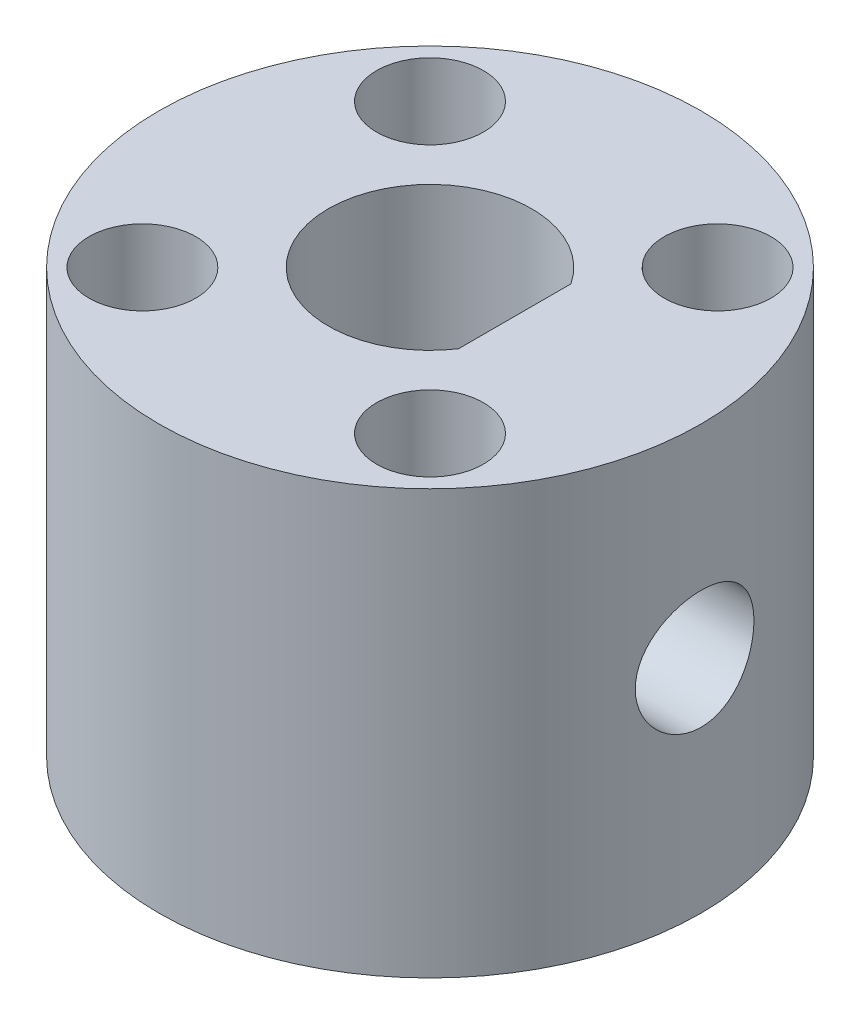
ISO-10303-21;
HEADER;
FILE_DESCRIPTION(('STEP AP214'),'2;1');
FILE_NAME('part.step','',(''),(''),'','','');
FILE_SCHEMA(('AUTOMOTIVE_DESIGN { 1 0 10303 214 1 1 1 1 }'));
ENDSEC;
DATA;
#1=APPLICATION_CONTEXT('core data for automotive mechanical design processes');
#2=APPLICATION_PROTOCOL_DEFINITION('international standard','automotive_design',2000,#1);
#3=PRODUCT_CONTEXT('',#1,'mechanical');
#4=PRODUCT('Part','Part','',(#3));
#5=PRODUCT_RELATED_PRODUCT_CATEGORY('part','',(#4));
#6=PRODUCT_DEFINITION_FORMATION('','',#4);
#7=PRODUCT_DEFINITION_CONTEXT('part definition',#1,'design');
#8=PRODUCT_DEFINITION('design','',#6,#7);
#9=PRODUCT_DEFINITION_SHAPE('','',#8);
#10=(LENGTH_UNIT() NAMED_UNIT(*) SI_UNIT(.MILLI.,.METRE.));
#11=(NAMED_UNIT(*) PLANE_ANGLE_UNIT() SI_UNIT($,.RADIAN.));
#12=(NAMED_UNIT(*) SI_UNIT($,.STERADIAN.) SOLID_ANGLE_UNIT());
#13=UNCERTAINTY_MEASURE_WITH_UNIT(LENGTH_MEASURE(1.E-05),#10,'distance_accuracy_value','');
#14=(GEOMETRIC_REPRESENTATION_CONTEXT(3) GLOBAL_UNCERTAINTY_ASSIGNED_CONTEXT((#13)) GLOBAL_UNIT_ASSIGNED_CONTEXT((#10,
#11,#12)) REPRESENTATION_CONTEXT('',''));
#15=CARTESIAN_POINT('',(0.,0.,0.));
#16=DIRECTION('',(0.,0.,1.));
#17=DIRECTION('',(1.,0.,0.));
#18=AXIS2_PLACEMENT_3D('',#15,#16,#17);
#19=CARTESIAN_POINT('',(2.5,12.5,-1.6583123951777));
#20=DIRECTION('',(-1.,0.,0.));
#21=DIRECTION('',(0.,0.,1.));
#22=AXIS2_PLACEMENT_3D('',#19,#20,#21);
#23=PLANE('',#22);
#24=CARTESIAN_POINT('',(2.5,6.5,0.));
#25=DIRECTION('',(-1.,0.,0.));
#26=DIRECTION('',(0.,0.,1.));
#27=AXIS2_PLACEMENT_3D('',#24,#25,#26);
#28=CIRCLE('',#27,1.75);
#29=CARTESIAN_POINT('',(2.5,7.05901699437495,1.6583123951777));
#30=VERTEX_POINT('',#29);
#31=CARTESIAN_POINT('',(2.5,7.05901699437495,-1.6583123951777));
#32=VERTEX_POINT('',#31);
#33=EDGE_CURVE('E96',#30,#32,#28,.T.);
#34=ORIENTED_EDGE('',*,*,#33,.F.);
#35=DIRECTION('',(0.,-1.,0.));
#36=VECTOR('',#35,1.);
#37=CARTESIAN_POINT('',(2.5,12.5,1.6583123951777));
#38=LINE('',#37,#36);
#39=CARTESIAN_POINT('',(2.5,12.5,1.6583123951777));
#40=VERTEX_POINT('',#39);
#41=EDGE_CURVE('E67',#40,#30,#38,.T.);
#42=ORIENTED_EDGE('',*,*,#41,.F.);
#43=DIRECTION('',(0.,0.,-1.));
#44=VECTOR('',#43,1.);
#45=CARTESIAN_POINT('',(2.5,12.5,-1.6583123951777));
#46=LINE('',#45,#44);
#47=CARTESIAN_POINT('',(2.5,12.5,-1.6583123951777));
#48=VERTEX_POINT('',#47);
#49=EDGE_CURVE('E128',#40,#48,#46,.T.);
#50=ORIENTED_EDGE('',*,*,#49,.T.);
#51=DIRECTION('',(0.,-1.,0.));
#52=VECTOR('',#51,1.);
#53=CARTESIAN_POINT('',(2.5,12.5,-1.6583123951777));
#54=LINE('',#53,#52);
#55=EDGE_CURVE('E104',#48,#32,#54,.T.);
#56=ORIENTED_EDGE('',*,*,#55,.T.);
#57=EDGE_LOOP('',(#34,#42,#50,#56));
#58=FACE_BOUND('',#57,.T.);
#59=ADVANCED_FACE('F43',(#58),#23,.T.);
#60=CARTESIAN_POINT('',(0.,12.5,0.));
#61=DIRECTION('',(0.,1.,0.));
#62=DIRECTION('',(0.,0.,1.));
#63=AXIS2_PLACEMENT_3D('',#60,#61,#62);
#64=PLANE('',#63);
#65=CARTESIAN_POINT('',(-4.24264068711904,12.5,4.24264068711953));
#66=DIRECTION('',(0.,1.,0.));
#67=DIRECTION('',(0.,0.,1.));
#68=AXIS2_PLACEMENT_3D('',#65,#66,#67);
#69=CIRCLE('',#68,1.575);
#70=CARTESIAN_POINT('',(-4.24264068711904,12.5,5.81764068711953));
#71=VERTEX_POINT('',#70);
#72=EDGE_CURVE('E141',#71,#71,#69,.T.);
#73=ORIENTED_EDGE('',*,*,#72,.F.);
#74=EDGE_LOOP('',(#73));
#75=FACE_BOUND('',#74,.T.);
#76=CARTESIAN_POINT('',(4.24264068711928,12.5,-4.24264068711929));
#77=DIRECTION('',(0.,1.,0.));
#78=DIRECTION('',(0.,0.,1.));
#79=AXIS2_PLACEMENT_3D('',#76,#77,#78);
#80=CIRCLE('',#79,1.575);
#81=CARTESIAN_POINT('',(4.24264068711928,12.5,-2.66764068711929));
#82=VERTEX_POINT('',#81);
#83=EDGE_CURVE('E295',#82,#82,#80,.T.);
#84=ORIENTED_EDGE('',*,*,#83,.F.);
#85=EDGE_LOOP('',(#84));
#86=FACE_BOUND('',#85,.T.);
#87=CARTESIAN_POINT('',(0.,12.5,0.));
#88=DIRECTION('',(0.,1.,0.));
#89=DIRECTION('',(0.,0.,1.));
#90=AXIS2_PLACEMENT_3D('',#87,#88,#89);
#91=CIRCLE('',#90,8.);
#92=CARTESIAN_POINT('',(0.,12.5,8.));
#93=VERTEX_POINT('',#92);
#94=EDGE_CURVE('E53',#93,#93,#91,.T.);
#95=ORIENTED_EDGE('',*,*,#94,.T.);
#96=EDGE_LOOP('',(#95));
#97=FACE_BOUND('',#96,.T.);
#98=CARTESIAN_POINT('',(4.24264068711953,12.5,4.24264068711928));
#99=DIRECTION('',(0.,1.,0.));
#100=DIRECTION('',(0.,0.,1.));
#101=AXIS2_PLACEMENT_3D('',#98,#99,#100);
#102=CIRCLE('',#101,1.575);
#103=CARTESIAN_POINT('',(4.24264068711953,12.5,5.81764068711928));
#104=VERTEX_POINT('',#103);
#105=EDGE_CURVE('E116',#104,#104,#102,.T.);
#106=ORIENTED_EDGE('',*,*,#105,.F.);
#107=EDGE_LOOP('',(#106));
#108=FACE_BOUND('',#107,.T.);
#109=ORIENTED_EDGE('',*,*,#49,.F.);
#110=CARTESIAN_POINT('',(0.,12.5,0.));
#111=DIRECTION('',(0.,1.,0.));
#112=DIRECTION('',(0.,0.,1.));
#113=AXIS2_PLACEMENT_3D('',#110,#111,#112);
#114=CIRCLE('',#113,3.);
#115=EDGE_CURVE('E110',#48,#40,#114,.T.);
#116=ORIENTED_EDGE('',*,*,#115,.F.);
#117=EDGE_LOOP('',(#109,#116));
#118=FACE_BOUND('',#117,.T.);
#119=CARTESIAN_POINT('',(-4.24264068711929,12.5,-4.24264068711904));
#120=DIRECTION('',(0.,1.,0.));
#121=DIRECTION('',(0.,0.,1.));
#122=AXIS2_PLACEMENT_3D('',#119,#120,#121);
#123=CIRCLE('',#122,1.575);
#124=CARTESIAN_POINT('',(-4.24264068711929,12.5,-2.66764068711904));
#125=VERTEX_POINT('',#124);
#126=EDGE_CURVE('E160',#125,#125,#123,.T.);
#127=ORIENTED_EDGE('',*,*,#126,.F.);
#128=EDGE_LOOP('',(#127));
#129=FACE_BOUND('',#128,.T.);
#130=ADVANCED_FACE('F186',(#75,#86,#97,#108,#118,#129),#64,.T.);
#131=CARTESIAN_POINT('',(0.,0.,0.));
#132=DIRECTION('',(0.,1.,0.));
#133=DIRECTION('',(0.,0.,1.));
#134=AXIS2_PLACEMENT_3D('',#131,#132,#133);
#135=PLANE('',#134);
#136=CARTESIAN_POINT('',(4.24264068711953,0.,4.24264068711928));
#137=DIRECTION('',(0.,1.,0.));
#138=DIRECTION('',(0.,0.,1.));
#139=AXIS2_PLACEMENT_3D('',#136,#137,#138);
#140=CIRCLE('',#139,1.575);
#141=CARTESIAN_POINT('',(4.24264068711953,0.,5.81764068711928));
#142=VERTEX_POINT('',#141);
#143=EDGE_CURVE('E113',#142,#142,#140,.T.);
#144=ORIENTED_EDGE('',*,*,#143,.T.);
#145=EDGE_LOOP('',(#144));
#146=FACE_BOUND('',#145,.T.);
#147=CARTESIAN_POINT('',(4.24264068711928,0.,-4.24264068711929));
#148=DIRECTION('',(0.,1.,0.));
#149=DIRECTION('',(0.,0.,1.));
#150=AXIS2_PLACEMENT_3D('',#147,#148,#149);
#151=CIRCLE('',#150,1.575);
#152=CARTESIAN_POINT('',(4.24264068711928,0.,-2.66764068711929));
#153=VERTEX_POINT('',#152);
#154=EDGE_CURVE('E289',#153,#153,#151,.T.);
#155=ORIENTED_EDGE('',*,*,#154,.T.);
#156=EDGE_LOOP('',(#155));
#157=FACE_BOUND('',#156,.T.);
#158=CARTESIAN_POINT('',(0.,0.,0.));
#159=DIRECTION('',(0.,1.,0.));
#160=DIRECTION('',(0.,0.,1.));
#161=AXIS2_PLACEMENT_3D('',#158,#159,#160);
#162=CIRCLE('',#161,8.);
#163=CARTESIAN_POINT('',(0.,0.,8.));
#164=VERTEX_POINT('',#163);
#165=EDGE_CURVE('E292',#164,#164,#162,.T.);
#166=ORIENTED_EDGE('',*,*,#165,.F.);
#167=EDGE_LOOP('',(#166));
#168=FACE_BOUND('',#167,.T.);
#169=CARTESIAN_POINT('',(0.,0.,0.));
#170=DIRECTION('',(0.,1.,0.));
#171=DIRECTION('',(0.,0.,1.));
#172=AXIS2_PLACEMENT_3D('',#169,#170,#171);
#173=CIRCLE('',#172,3.);
#174=CARTESIAN_POINT('',(2.5,0.,-1.6583123951777));
#175=VERTEX_POINT('',#174);
#176=CARTESIAN_POINT('',(2.5,0.,1.6583123951777));
#177=VERTEX_POINT('',#176);
#178=EDGE_CURVE('E138',#175,#177,#173,.T.);
#179=ORIENTED_EDGE('',*,*,#178,.T.);
#180=DIRECTION('',(0.,0.,-1.));
#181=VECTOR('',#180,1.);
#182=CARTESIAN_POINT('',(2.5,0.,-1.6583123951777));
#183=LINE('',#182,#181);
#184=EDGE_CURVE('E134',#177,#175,#183,.T.);
#185=ORIENTED_EDGE('',*,*,#184,.T.);
#186=EDGE_LOOP('',(#179,#185));
#187=FACE_BOUND('',#186,.T.);
#188=CARTESIAN_POINT('',(-4.24264068711904,0.,4.24264068711953));
#189=DIRECTION('',(0.,1.,0.));
#190=DIRECTION('',(0.,0.,1.));
#191=AXIS2_PLACEMENT_3D('',#188,#189,#190);
#192=CIRCLE('',#191,1.575);
#193=CARTESIAN_POINT('',(-4.24264068711904,0.,5.81764068711953));
#194=VERTEX_POINT('',#193);
#195=EDGE_CURVE('E314',#194,#194,#192,.T.);
#196=ORIENTED_EDGE('',*,*,#195,.T.);
#197=EDGE_LOOP('',(#196));
#198=FACE_BOUND('',#197,.T.);
#199=CARTESIAN_POINT('',(-4.24264068711929,0.,-4.24264068711904));
#200=DIRECTION('',(0.,1.,0.));
#201=DIRECTION('',(0.,0.,1.));
#202=AXIS2_PLACEMENT_3D('',#199,#200,#201);
#203=CIRCLE('',#202,1.575);
#204=CARTESIAN_POINT('',(-4.24264068711929,0.,-2.66764068711904));
#205=VERTEX_POINT('',#204);
#206=EDGE_CURVE('E159',#205,#205,#203,.T.);
#207=ORIENTED_EDGE('',*,*,#206,.T.);
#208=EDGE_LOOP('',(#207));
#209=FACE_BOUND('',#208,.T.);
#210=ADVANCED_FACE('F145',(#146,#157,#168,#187,#198,#209),#135,.F.);
#211=CARTESIAN_POINT('',(0.,12.5,0.));
#212=DIRECTION('',(0.,-1.,0.));
#213=DIRECTION('',(0.,0.,-1.));
#214=AXIS2_PLACEMENT_3D('',#211,#212,#213);
#215=CYLINDRICAL_SURFACE('',#214,8.);
#216=CARTESIAN_POINT('',(7.806247497998,6.5,1.75));
#217=CARTESIAN_POINT('',(7.80624945905135,6.5970280134328,1.74999666332348));
#218=CARTESIAN_POINT('',(7.80807622046454,6.69409613131077,1.74190303951004));
#219=CARTESIAN_POINT('',(7.81517245186505,6.88547190452197,1.70977784205172));
#220=CARTESIAN_POINT('',(7.82044441049014,6.9797775128667,1.68573474711853));
#221=CARTESIAN_POINT('',(7.83380603690741,7.16283224840003,1.62250390010279));
#222=CARTESIAN_POINT('',(7.84189261163066,7.25158734942516,1.58333276753284));
#223=CARTESIAN_POINT('',(7.85996859341366,7.42126808384546,1.49100532370988));
#224=CARTESIAN_POINT('',(7.86995796134536,7.50219387818681,1.43784930002628));
#225=CARTESIAN_POINT('',(7.89090255292062,7.65528746219411,1.31810359988612));
#226=CARTESIAN_POINT('',(7.9018701337505,7.72730370192507,1.25132229635412));
#227=CARTESIAN_POINT('',(7.92342719705843,7.85920661250848,1.10663537787889));
#228=CARTESIAN_POINT('',(7.93401665008983,7.91909234038854,1.02872889891566));
#229=CARTESIAN_POINT('',(7.95375888221752,8.02563376766824,0.862987032725175));
#230=CARTESIAN_POINT('',(7.96289538073787,8.07214370475895,0.775055841165997));
#231=CARTESIAN_POINT('',(7.97856268454442,8.14967026302601,0.592392423905255));
#232=CARTESIAN_POINT('',(7.98509378226925,8.18068862312565,0.497660962897147));
#233=CARTESIAN_POINT('',(7.99472708358188,8.2258748825834,0.305661830671521));
#234=CARTESIAN_POINT('',(7.99788142586321,8.24029926939322,0.208457182926348));
#235=CARTESIAN_POINT('',(8.0005864524206,8.25269005951142,0.0129599543265384));
#236=CARTESIAN_POINT('',(8.0001375490446,8.25065834602135,-0.0853325007561179));
#237=CARTESIAN_POINT('',(7.99572650969379,8.23038562955477,-0.278447020872957));
#238=CARTESIAN_POINT('',(7.99182429717546,8.21242108892483,-0.373299678484486));
#239=CARTESIAN_POINT('',(7.98101337797756,8.1612332198815,-0.558610512900447));
#240=CARTESIAN_POINT('',(7.97410453534111,8.12800920144575,-0.649068490776132));
#241=CARTESIAN_POINT('',(7.95796028660624,8.0470009519331,-0.823789626976182));
#242=CARTESIAN_POINT('',(7.94870822179818,7.99911193007744,-0.908002597477633));
#243=CARTESIAN_POINT('',(7.92889198192016,7.89021121300223,-1.0672978291922));
#244=CARTESIAN_POINT('',(7.91832762815045,7.82919772974151,-1.14237884410839));
#245=CARTESIAN_POINT('',(7.89678896628589,7.69427494914098,-1.2829231189912));
#246=CARTESIAN_POINT('',(7.88581070205046,7.62012369439249,-1.34815369731024));
#247=CARTESIAN_POINT('',(7.86488750618514,7.46182107960562,-1.46529720114584));
#248=CARTESIAN_POINT('',(7.85494260258143,7.37766944847562,-1.51720976551523));
#249=CARTESIAN_POINT('',(7.83720169317003,7.20137855391294,-1.6063470980224));
#250=CARTESIAN_POINT('',(7.82941214351679,7.10921635629231,-1.64352787918374));
#251=CARTESIAN_POINT('',(7.81695337423894,6.91974131726177,-1.7018041084034));
#252=CARTESIAN_POINT('',(7.81228365953274,6.82242929571543,-1.72290210868729));
#253=CARTESIAN_POINT('',(7.80669425421976,6.6275430724976,-1.74805293703087));
#254=CARTESIAN_POINT('',(7.8057000358533,6.5300146817394,-1.75244457285897));
#255=CARTESIAN_POINT('',(7.80737314858982,6.3356192963787,-1.74497530075208));
#256=CARTESIAN_POINT('',(7.81004022809689,6.23875225678935,-1.73311550957759));
#257=CARTESIAN_POINT('',(7.81866504603975,6.04960908479507,-1.69377399635069));
#258=CARTESIAN_POINT('',(7.82458345002008,5.95729217598327,-1.66647889658488));
#259=CARTESIAN_POINT('',(7.83900857622703,5.7785420299274,-1.59724364761113));
#260=CARTESIAN_POINT('',(7.84751554623324,5.69210935689667,-1.55530209637649));
#261=CARTESIAN_POINT('',(7.86632301994175,5.52611502156563,-1.45721807999334));
#262=CARTESIAN_POINT('',(7.87664912166245,5.44667964078173,-1.40086690882525));
#263=CARTESIAN_POINT('',(7.89786385707838,5.29826831630606,-1.27583634037906));
#264=CARTESIAN_POINT('',(7.90875256052719,5.22929367376997,-1.20715541178423));
#265=CARTESIAN_POINT('',(7.93011129182084,5.10244662987705,-1.05788176090421));
#266=CARTESIAN_POINT('',(7.94056972743614,5.04480521977106,-0.977090811057815));
#267=CARTESIAN_POINT('',(7.95967616453578,4.94391275727052,-0.806775937992834));
#268=CARTESIAN_POINT('',(7.96832425057138,4.900661032759,-0.717252422909713));
#269=CARTESIAN_POINT('',(7.98278670652031,4.83009735306519,-0.532571442115365));
#270=CARTESIAN_POINT('',(7.98861898874485,4.80268441612702,-0.437454026381446));
#271=CARTESIAN_POINT('',(7.99687014437095,4.7642611388551,-0.243822113274709));
#272=CARTESIAN_POINT('',(7.99928951409338,4.75324841351692,-0.145308111983489));
#273=CARTESIAN_POINT('',(8.00042750683747,4.74804542172717,0.0501276775760973));
#274=CARTESIAN_POINT('',(7.99922200056368,4.75351027681963,0.147040003201597));
#275=CARTESIAN_POINT('',(7.99340825361615,4.78033588259217,0.338529305331091));
#276=CARTESIAN_POINT('',(7.98880007413318,4.8016963474192,0.433106323799652));
#277=CARTESIAN_POINT('',(7.97670437671938,4.85954154393653,0.616973514243788));
#278=CARTESIAN_POINT('',(7.96922617829729,4.89597735265226,0.706279729669992));
#279=CARTESIAN_POINT('',(7.95218899565129,4.98289125993948,0.877557024231171));
#280=CARTESIAN_POINT('',(7.94262980942251,5.03337072188345,0.959527390172563));
#281=CARTESIAN_POINT('',(7.92224687676354,5.14806349215517,1.11548832576446));
#282=CARTESIAN_POINT('',(7.91140257019292,5.21251931550726,1.18929788040884));
#283=CARTESIAN_POINT('',(7.88978238696403,5.35284600036101,1.32517104073326));
#284=CARTESIAN_POINT('',(7.87900652743123,5.42871960976419,1.38723181070999));
#285=CARTESIAN_POINT('',(7.85858267483524,5.5909483927375,1.4986453367496));
#286=CARTESIAN_POINT('',(7.84895169360709,5.67743017770953,1.54781703198666));
#287=CARTESIAN_POINT('',(7.83212199429224,5.85762202329952,1.63085060859479));
#288=CARTESIAN_POINT('',(7.82492121927565,5.95132588819277,1.66472544549927));
#289=CARTESIAN_POINT('',(7.81509833526494,6.12093736069939,1.71015691938045));
#290=CARTESIAN_POINT('',(7.81180130346357,6.19592505147677,1.72506941603846));
#291=CARTESIAN_POINT('',(7.80737516581754,6.34726692233281,1.74499202826869));
#292=CARTESIAN_POINT('',(7.80624595428687,6.42362103561219,1.7500026265806));
#293=CARTESIAN_POINT('',(7.806247497998,6.5,1.75));
#294=B_SPLINE_CURVE_WITH_KNOTS('',3,(#216,#217,#218,#219,#220,#221,#222,#223,#224,#225,#226,
#227,#228,#229,#230,#231,#232,#233,#234,#235,#236,#237,#238,#239,#240,#241,#242,#243,#244,#245,
#246,#247,#248,#249,#250,#251,#252,#253,#254,#255,#256,#257,#258,#259,#260,#261,#262,#263,#264,
#265,#266,#267,#268,#269,#270,#271,#272,#273,#274,#275,#276,#277,#278,#279,#280,#281,#282,#283,
#284,#285,#286,#287,#288,#289,#290,#291,#292,#293),.UNSPECIFIED.,.T.,.F.,(4,2,2,2,2,2,2,2,2,2,2,
2,2,2,2,2,2,2,2,2,2,2,2,2,2,2,2,2,2,2,2,2,2,2,2,2,2,2,4),(0.,0.290804115870692,
0.581818526599534,0.872514137052688,1.16320377043854,1.45830491896335,1.75342899855111,
2.05165686348641,2.34985124493558,2.64337184515389,2.93685885596571,3.2253508676411,
3.51385592599757,3.8044726414071,4.09512897475707,4.39183436537594,4.68854780096223,
4.98614062158782,5.28368620646371,5.57516431760517,5.86662240004893,6.15462969113393,
6.44266455918165,6.7351342450112,7.02764027980828,7.32560034403598,7.62354648911712,
7.91957146995089,8.21555339708043,8.50538367763981,8.79520874626514,9.08410055231566,
9.37302041407614,9.6674247415535,9.96190003653334,10.2603137141584,10.5584741768494,
10.7874018788084,11.0163184197546),.UNSPECIFIED.);
#295=CARTESIAN_POINT('',(7.806247497998,6.5,1.75));
#296=VERTEX_POINT('',#295);
#297=EDGE_CURVE('E106',#296,#296,#294,.T.);
#298=ORIENTED_EDGE('',*,*,#297,.T.);
#299=EDGE_LOOP('',(#298));
#300=FACE_BOUND('',#299,.T.);
#301=ORIENTED_EDGE('',*,*,#94,.F.);
#302=EDGE_LOOP('',(#301));
#303=FACE_BOUND('',#302,.T.);
#304=ORIENTED_EDGE('',*,*,#165,.T.);
#305=EDGE_LOOP('',(#304));
#306=FACE_BOUND('',#305,.T.);
#307=ADVANCED_FACE('F45',(#300,#303,#306),#215,.T.);
#308=CARTESIAN_POINT('',(4.24264068711928,12.5,-4.24264068711929));
#309=DIRECTION('',(0.,-1.,0.));
#310=DIRECTION('',(0.,0.,-1.));
#311=AXIS2_PLACEMENT_3D('',#308,#309,#310);
#312=CYLINDRICAL_SURFACE('',#311,1.575);
#313=ORIENTED_EDGE('',*,*,#83,.T.);
#314=EDGE_LOOP('',(#313));
#315=FACE_BOUND('',#314,.T.);
#316=ORIENTED_EDGE('',*,*,#154,.F.);
#317=EDGE_LOOP('',(#316));
#318=FACE_BOUND('',#317,.T.);
#319=ADVANCED_FACE('F181',(#315,#318),#312,.F.);
#320=CARTESIAN_POINT('',(4.24264068711953,12.5,4.24264068711928));
#321=DIRECTION('',(0.,-1.,0.));
#322=DIRECTION('',(0.,0.,-1.));
#323=AXIS2_PLACEMENT_3D('',#320,#321,#322);
#324=CYLINDRICAL_SURFACE('',#323,1.575);
#325=ORIENTED_EDGE('',*,*,#105,.T.);
#326=EDGE_LOOP('',(#325));
#327=FACE_BOUND('',#326,.T.);
#328=ORIENTED_EDGE('',*,*,#143,.F.);
#329=EDGE_LOOP('',(#328));
#330=FACE_BOUND('',#329,.T.);
#331=ADVANCED_FACE('F178',(#327,#330),#324,.F.);
#332=CARTESIAN_POINT('',(0.,12.5,0.));
#333=DIRECTION('',(0.,-1.,0.));
#334=DIRECTION('',(0.,0.,-1.));
#335=AXIS2_PLACEMENT_3D('',#332,#333,#334);
#336=CYLINDRICAL_SURFACE('',#335,3.);
#337=ORIENTED_EDGE('',*,*,#178,.F.);
#338=CARTESIAN_POINT('',(2.5,5.94098300562505,-1.6583123951777));
#339=VERTEX_POINT('',#338);
#340=EDGE_CURVE('E124',#339,#175,#54,.T.);
#341=ORIENTED_EDGE('',*,*,#340,.F.);
#342=EDGE_CURVE('E123',#32,#339,#54,.T.);
#343=ORIENTED_EDGE('',*,*,#342,.F.);
#344=ORIENTED_EDGE('',*,*,#55,.F.);
#345=ORIENTED_EDGE('',*,*,#115,.T.);
#346=ORIENTED_EDGE('',*,*,#41,.T.);
#347=CARTESIAN_POINT('',(2.5,5.94098300562505,1.6583123951777));
#348=VERTEX_POINT('',#347);
#349=EDGE_CURVE('E86',#30,#348,#38,.T.);
#350=ORIENTED_EDGE('',*,*,#349,.T.);
#351=EDGE_CURVE('E92',#348,#177,#38,.T.);
#352=ORIENTED_EDGE('',*,*,#351,.T.);
#353=EDGE_LOOP('',(#337,#341,#343,#344,#345,#346,#350,#352));
#354=FACE_BOUND('',#353,.T.);
#355=ADVANCED_FACE('F108',(#354),#336,.F.);
#356=CARTESIAN_POINT('',(2.5,6.5,0.));
#357=DIRECTION('',(-1.,0.,0.));
#358=DIRECTION('',(0.,0.,1.));
#359=AXIS2_PLACEMENT_3D('',#356,#357,#358);
#360=CIRCLE('',#359,1.75);
#361=EDGE_CURVE('E11',#339,#348,#360,.T.);
#362=ORIENTED_EDGE('',*,*,#361,.F.);
#363=ORIENTED_EDGE('',*,*,#340,.T.);
#364=ORIENTED_EDGE('',*,*,#184,.F.);
#365=ORIENTED_EDGE('',*,*,#351,.F.);
#366=EDGE_LOOP('',(#362,#363,#364,#365));
#367=FACE_BOUND('',#366,.T.);
#368=ADVANCED_FACE('F147',(#367),#23,.T.);
#369=CARTESIAN_POINT('',(-4.24264068711904,12.5,4.24264068711953));
#370=DIRECTION('',(0.,-1.,0.));
#371=DIRECTION('',(0.,0.,-1.));
#372=AXIS2_PLACEMENT_3D('',#369,#370,#371);
#373=CYLINDRICAL_SURFACE('',#372,1.575);
#374=ORIENTED_EDGE('',*,*,#72,.T.);
#375=EDGE_LOOP('',(#374));
#376=FACE_BOUND('',#375,.T.);
#377=ORIENTED_EDGE('',*,*,#195,.F.);
#378=EDGE_LOOP('',(#377));
#379=FACE_BOUND('',#378,.T.);
#380=ADVANCED_FACE('F169',(#376,#379),#373,.F.);
#381=CARTESIAN_POINT('',(-4.24264068711929,12.5,-4.24264068711904));
#382=DIRECTION('',(0.,-1.,0.));
#383=DIRECTION('',(0.,0.,-1.));
#384=AXIS2_PLACEMENT_3D('',#381,#382,#383);
#385=CYLINDRICAL_SURFACE('',#384,1.575);
#386=ORIENTED_EDGE('',*,*,#126,.T.);
#387=EDGE_LOOP('',(#386));
#388=FACE_BOUND('',#387,.T.);
#389=ORIENTED_EDGE('',*,*,#206,.F.);
#390=EDGE_LOOP('',(#389));
#391=FACE_BOUND('',#390,.T.);
#392=ADVANCED_FACE('F166',(#388,#391),#385,.F.);
#393=CARTESIAN_POINT('',(2.5,6.5,0.));
#394=DIRECTION('',(-1.,0.,0.));
#395=DIRECTION('',(0.,0.,1.));
#396=AXIS2_PLACEMENT_3D('',#393,#394,#395);
#397=PLANE('',#396);
#398=ORIENTED_EDGE('',*,*,#342,.T.);
#399=EDGE_CURVE('E59',#32,#339,#28,.T.);
#400=ORIENTED_EDGE('',*,*,#399,.F.);
#401=EDGE_LOOP('',(#398,#400));
#402=FACE_BOUND('',#401,.T.);
#403=ADVANCED_FACE('F149',(#402),#397,.F.);
#404=CARTESIAN_POINT('',(12.5,6.5,0.));
#405=DIRECTION('',(-1.,0.,0.));
#406=DIRECTION('',(0.,0.,1.));
#407=AXIS2_PLACEMENT_3D('',#404,#405,#406);
#408=CYLINDRICAL_SURFACE('',#407,1.75);
#409=ORIENTED_EDGE('',*,*,#33,.T.);
#410=ORIENTED_EDGE('',*,*,#399,.T.);
#411=ORIENTED_EDGE('',*,*,#361,.T.);
#412=EDGE_CURVE('E89',#348,#30,#28,.T.);
#413=ORIENTED_EDGE('',*,*,#412,.T.);
#414=EDGE_LOOP('',(#409,#410,#411,#413));
#415=FACE_BOUND('',#414,.T.);
#416=ORIENTED_EDGE('',*,*,#297,.F.);
#417=EDGE_LOOP('',(#416));
#418=FACE_BOUND('',#417,.T.);
#419=ADVANCED_FACE('F94',(#415,#418),#408,.F.);
#420=ORIENTED_EDGE('',*,*,#349,.F.);
#421=ORIENTED_EDGE('',*,*,#412,.F.);
#422=EDGE_LOOP('',(#420,#421));
#423=FACE_BOUND('',#422,.T.);
#424=ADVANCED_FACE('F88',(#423),#397,.F.);
#425=CLOSED_SHELL('',(#59,#130,#210,#307,#319,#331,#355,#368,#380,#392,#403,#419,#424));
#426=MANIFOLD_SOLID_BREP('B2',#425);
#427=ADVANCED_BREP_SHAPE_REPRESENTATION('',(#18,#426),#14);
#428=SHAPE_DEFINITION_REPRESENTATION(#9,#427);
ENDSEC;
END-ISO-10303-21;
